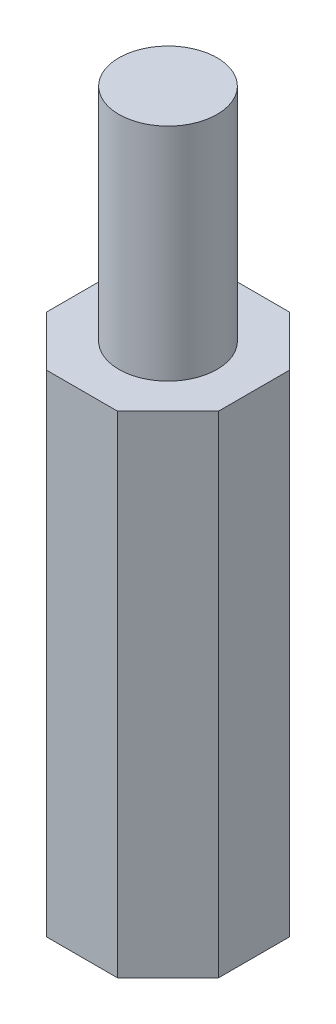
ISO-10303-21;
HEADER;
FILE_DESCRIPTION(('STEP AP214'),'2;1');
FILE_NAME('part.step','',(''),(''),'','','');
FILE_SCHEMA(('AUTOMOTIVE_DESIGN { 1 0 10303 214 1 1 1 1 }'));
ENDSEC;
DATA;
#1=APPLICATION_CONTEXT('core data for automotive mechanical design processes');
#2=APPLICATION_PROTOCOL_DEFINITION('international standard','automotive_design',2000,#1);
#3=PRODUCT_CONTEXT('',#1,'mechanical');
#4=PRODUCT('Part','Part','',(#3));
#5=PRODUCT_RELATED_PRODUCT_CATEGORY('part','',(#4));
#6=PRODUCT_DEFINITION_FORMATION('','',#4);
#7=PRODUCT_DEFINITION_CONTEXT('part definition',#1,'design');
#8=PRODUCT_DEFINITION('design','',#6,#7);
#9=PRODUCT_DEFINITION_SHAPE('','',#8);
#10=(LENGTH_UNIT() NAMED_UNIT(*) SI_UNIT(.MILLI.,.METRE.));
#11=(NAMED_UNIT(*) PLANE_ANGLE_UNIT() SI_UNIT($,.RADIAN.));
#12=(NAMED_UNIT(*) SI_UNIT($,.STERADIAN.) SOLID_ANGLE_UNIT());
#13=UNCERTAINTY_MEASURE_WITH_UNIT(LENGTH_MEASURE(1.E-05),#10,'distance_accuracy_value','');
#14=(GEOMETRIC_REPRESENTATION_CONTEXT(3) GLOBAL_UNCERTAINTY_ASSIGNED_CONTEXT((#13)) GLOBAL_UNIT_ASSIGNED_CONTEXT((#10,
#11,#12)) REPRESENTATION_CONTEXT('',''));
#15=CARTESIAN_POINT('',(0.,0.,0.));
#16=DIRECTION('',(0.,0.,1.));
#17=DIRECTION('',(1.,0.,0.));
#18=AXIS2_PLACEMENT_3D('',#15,#16,#17);
#19=CARTESIAN_POINT('',(-4.94974746830584,10.,0.));
#20=DIRECTION('',(0.,1.,0.));
#21=DIRECTION('',(0.,0.,1.));
#22=AXIS2_PLACEMENT_3D('',#19,#20,#21);
#23=PLANE('',#22);
#24=DIRECTION('',(-0.707106781186548,0.,0.707106781186546));
#25=VECTOR('',#24,1.);
#26=CARTESIAN_POINT('',(-3.5,10.,-1.44974746830583));
#27=LINE('',#26,#25);
#28=CARTESIAN_POINT('',(-1.44974746830583,10.,-3.5));
#29=VERTEX_POINT('',#28);
#30=CARTESIAN_POINT('',(-3.5,10.,-1.44974746830583));
#31=VERTEX_POINT('',#30);
#32=EDGE_CURVE('E144',#29,#31,#27,.T.);
#33=ORIENTED_EDGE('',*,*,#32,.T.);
#34=DIRECTION('',(0.,0.,1.));
#35=VECTOR('',#34,1.);
#36=CARTESIAN_POINT('',(-3.5,10.,1.44974746830583));
#37=LINE('',#36,#35);
#38=CARTESIAN_POINT('',(-3.5,10.,1.44974746830583));
#39=VERTEX_POINT('',#38);
#40=EDGE_CURVE('E92',#31,#39,#37,.T.);
#41=ORIENTED_EDGE('',*,*,#40,.T.);
#42=DIRECTION('',(0.707106781186548,0.,0.707106781186548));
#43=VECTOR('',#42,1.);
#44=CARTESIAN_POINT('',(-1.44974746830583,10.,3.5));
#45=LINE('',#44,#43);
#46=CARTESIAN_POINT('',(-1.44974746830583,10.,3.5));
#47=VERTEX_POINT('',#46);
#48=EDGE_CURVE('E159',#39,#47,#45,.T.);
#49=ORIENTED_EDGE('',*,*,#48,.T.);
#50=DIRECTION('',(1.,0.,0.));
#51=VECTOR('',#50,1.);
#52=CARTESIAN_POINT('',(1.44974746830583,10.,3.5));
#53=LINE('',#52,#51);
#54=CARTESIAN_POINT('',(1.44974746830583,10.,3.5));
#55=VERTEX_POINT('',#54);
#56=EDGE_CURVE('E171',#47,#55,#53,.T.);
#57=ORIENTED_EDGE('',*,*,#56,.T.);
#58=DIRECTION('',(0.707106781186548,0.,-0.707106781186547));
#59=VECTOR('',#58,1.);
#60=CARTESIAN_POINT('',(3.5,10.,1.44974746830583));
#61=LINE('',#60,#59);
#62=CARTESIAN_POINT('',(3.5,10.,1.44974746830583));
#63=VERTEX_POINT('',#62);
#64=EDGE_CURVE('E111',#55,#63,#61,.T.);
#65=ORIENTED_EDGE('',*,*,#64,.T.);
#66=DIRECTION('',(0.,0.,-1.));
#67=VECTOR('',#66,1.);
#68=CARTESIAN_POINT('',(3.5,10.,-1.44974746830583));
#69=LINE('',#68,#67);
#70=CARTESIAN_POINT('',(3.5,10.,-1.44974746830583));
#71=VERTEX_POINT('',#70);
#72=EDGE_CURVE('E105',#63,#71,#69,.T.);
#73=ORIENTED_EDGE('',*,*,#72,.T.);
#74=DIRECTION('',(-0.707106781186548,0.,-0.707106781186547));
#75=VECTOR('',#74,1.);
#76=CARTESIAN_POINT('',(1.44974746830583,10.,-3.5));
#77=LINE('',#76,#75);
#78=CARTESIAN_POINT('',(1.44974746830583,10.,-3.5));
#79=VERTEX_POINT('',#78);
#80=EDGE_CURVE('E109',#71,#79,#77,.T.);
#81=ORIENTED_EDGE('',*,*,#80,.T.);
#82=DIRECTION('',(-1.,0.,0.));
#83=VECTOR('',#82,1.);
#84=CARTESIAN_POINT('',(-1.44974746830583,10.,-3.5));
#85=LINE('',#84,#83);
#86=EDGE_CURVE('E49',#79,#29,#85,.T.);
#87=ORIENTED_EDGE('',*,*,#86,.T.);
#88=EDGE_LOOP('',(#33,#41,#49,#57,#65,#73,#81,#87));
#89=FACE_BOUND('',#88,.T.);
#90=CARTESIAN_POINT('',(0.,10.,0.));
#91=DIRECTION('',(0.,1.,0.));
#92=DIRECTION('',(0.,0.,1.));
#93=AXIS2_PLACEMENT_3D('',#90,#91,#92);
#94=CIRCLE('',#93,2.);
#95=CARTESIAN_POINT('',(0.,10.,2.));
#96=VERTEX_POINT('',#95);
#97=EDGE_CURVE('E177',#96,#96,#94,.T.);
#98=ORIENTED_EDGE('',*,*,#97,.F.);
#99=EDGE_LOOP('',(#98));
#100=FACE_BOUND('',#99,.T.);
#101=ADVANCED_FACE('F32',(#89,#100),#23,.T.);
#102=CARTESIAN_POINT('',(-3.5,10.,-1.44974746830583));
#103=DIRECTION('',(0.707106781186546,0.,0.707106781186548));
#104=DIRECTION('',(0.707106781186549,0.,-0.707106781186547));
#105=AXIS2_PLACEMENT_3D('',#102,#103,#104);
#106=PLANE('',#105);
#107=DIRECTION('',(-0.707106781186548,0.,0.707106781186546));
#108=VECTOR('',#107,1.);
#109=CARTESIAN_POINT('',(-3.5,-10.,-1.44974746830583));
#110=LINE('',#109,#108);
#111=CARTESIAN_POINT('',(-1.44974746830583,-10.,-3.5));
#112=VERTEX_POINT('',#111);
#113=CARTESIAN_POINT('',(-3.5,-10.,-1.44974746830583));
#114=VERTEX_POINT('',#113);
#115=EDGE_CURVE('E129',#112,#114,#110,.T.);
#116=ORIENTED_EDGE('',*,*,#115,.T.);
#117=DIRECTION('',(0.,-1.,0.));
#118=VECTOR('',#117,1.);
#119=CARTESIAN_POINT('',(-3.5,10.,-1.44974746830583));
#120=LINE('',#119,#118);
#121=EDGE_CURVE('E11',#31,#114,#120,.T.);
#122=ORIENTED_EDGE('',*,*,#121,.F.);
#123=ORIENTED_EDGE('',*,*,#32,.F.);
#124=DIRECTION('',(0.,-1.,0.));
#125=VECTOR('',#124,1.);
#126=CARTESIAN_POINT('',(-1.44974746830583,10.,-3.5));
#127=LINE('',#126,#125);
#128=EDGE_CURVE('E125',#29,#112,#127,.T.);
#129=ORIENTED_EDGE('',*,*,#128,.T.);
#130=EDGE_LOOP('',(#116,#122,#123,#129));
#131=FACE_BOUND('',#130,.T.);
#132=ADVANCED_FACE('F34',(#131),#106,.F.);
#133=CARTESIAN_POINT('',(-3.5,10.,1.44974746830583));
#134=DIRECTION('',(1.,0.,0.));
#135=DIRECTION('',(0.,0.,-1.));
#136=AXIS2_PLACEMENT_3D('',#133,#134,#135);
#137=PLANE('',#136);
#138=DIRECTION('',(0.,0.,1.));
#139=VECTOR('',#138,1.);
#140=CARTESIAN_POINT('',(-3.5,-10.,1.44974746830583));
#141=LINE('',#140,#139);
#142=CARTESIAN_POINT('',(-3.5,-10.,1.44974746830583));
#143=VERTEX_POINT('',#142);
#144=EDGE_CURVE('E132',#114,#143,#141,.T.);
#145=ORIENTED_EDGE('',*,*,#144,.T.);
#146=DIRECTION('',(0.,-1.,0.));
#147=VECTOR('',#146,1.);
#148=CARTESIAN_POINT('',(-3.5,10.,1.44974746830583));
#149=LINE('',#148,#147);
#150=EDGE_CURVE('E41',#39,#143,#149,.T.);
#151=ORIENTED_EDGE('',*,*,#150,.F.);
#152=ORIENTED_EDGE('',*,*,#40,.F.);
#153=ORIENTED_EDGE('',*,*,#121,.T.);
#154=EDGE_LOOP('',(#145,#151,#152,#153));
#155=FACE_BOUND('',#154,.T.);
#156=ADVANCED_FACE('F214',(#155),#137,.F.);
#157=CARTESIAN_POINT('',(-1.44974746830583,10.,3.5));
#158=DIRECTION('',(0.707106781186548,0.,-0.707106781186548));
#159=DIRECTION('',(-0.707106781186548,0.,-0.707106781186548));
#160=AXIS2_PLACEMENT_3D('',#157,#158,#159);
#161=PLANE('',#160);
#162=DIRECTION('',(0.707106781186548,0.,0.707106781186548));
#163=VECTOR('',#162,1.);
#164=CARTESIAN_POINT('',(-1.44974746830583,-10.,3.5));
#165=LINE('',#164,#163);
#166=CARTESIAN_POINT('',(-1.44974746830583,-10.,3.5));
#167=VERTEX_POINT('',#166);
#168=EDGE_CURVE('E135',#143,#167,#165,.T.);
#169=ORIENTED_EDGE('',*,*,#168,.T.);
#170=DIRECTION('',(0.,-1.,0.));
#171=VECTOR('',#170,1.);
#172=CARTESIAN_POINT('',(-1.44974746830583,10.,3.5));
#173=LINE('',#172,#171);
#174=EDGE_CURVE('E151',#47,#167,#173,.T.);
#175=ORIENTED_EDGE('',*,*,#174,.F.);
#176=ORIENTED_EDGE('',*,*,#48,.F.);
#177=ORIENTED_EDGE('',*,*,#150,.T.);
#178=EDGE_LOOP('',(#169,#175,#176,#177));
#179=FACE_BOUND('',#178,.T.);
#180=ADVANCED_FACE('F157',(#179),#161,.F.);
#181=CARTESIAN_POINT('',(1.44974746830583,10.,3.5));
#182=DIRECTION('',(0.,0.,-1.));
#183=DIRECTION('',(-1.,0.,0.));
#184=AXIS2_PLACEMENT_3D('',#181,#182,#183);
#185=PLANE('',#184);
#186=DIRECTION('',(1.,0.,0.));
#187=VECTOR('',#186,1.);
#188=CARTESIAN_POINT('',(1.44974746830583,-10.,3.5));
#189=LINE('',#188,#187);
#190=CARTESIAN_POINT('',(1.44974746830583,-10.,3.5));
#191=VERTEX_POINT('',#190);
#192=EDGE_CURVE('E137',#167,#191,#189,.T.);
#193=ORIENTED_EDGE('',*,*,#192,.T.);
#194=DIRECTION('',(0.,-1.,0.));
#195=VECTOR('',#194,1.);
#196=CARTESIAN_POINT('',(1.44974746830583,10.,3.5));
#197=LINE('',#196,#195);
#198=EDGE_CURVE('E148',#55,#191,#197,.T.);
#199=ORIENTED_EDGE('',*,*,#198,.F.);
#200=ORIENTED_EDGE('',*,*,#56,.F.);
#201=ORIENTED_EDGE('',*,*,#174,.T.);
#202=EDGE_LOOP('',(#193,#199,#200,#201));
#203=FACE_BOUND('',#202,.T.);
#204=ADVANCED_FACE('F167',(#203),#185,.F.);
#205=CARTESIAN_POINT('',(3.5,10.,1.44974746830583));
#206=DIRECTION('',(-0.707106781186547,0.,-0.707106781186548));
#207=DIRECTION('',(-0.707106781186548,0.,0.707106781186547));
#208=AXIS2_PLACEMENT_3D('',#205,#206,#207);
#209=PLANE('',#208);
#210=DIRECTION('',(0.707106781186548,0.,-0.707106781186547));
#211=VECTOR('',#210,1.);
#212=CARTESIAN_POINT('',(3.5,-10.,1.44974746830583));
#213=LINE('',#212,#211);
#214=CARTESIAN_POINT('',(3.5,-10.,1.44974746830583));
#215=VERTEX_POINT('',#214);
#216=EDGE_CURVE('E139',#191,#215,#213,.T.);
#217=ORIENTED_EDGE('',*,*,#216,.T.);
#218=DIRECTION('',(0.,-1.,0.));
#219=VECTOR('',#218,1.);
#220=CARTESIAN_POINT('',(3.5,10.,1.44974746830583));
#221=LINE('',#220,#219);
#222=EDGE_CURVE('E120',#63,#215,#221,.T.);
#223=ORIENTED_EDGE('',*,*,#222,.F.);
#224=ORIENTED_EDGE('',*,*,#64,.F.);
#225=ORIENTED_EDGE('',*,*,#198,.T.);
#226=EDGE_LOOP('',(#217,#223,#224,#225));
#227=FACE_BOUND('',#226,.T.);
#228=ADVANCED_FACE('F170',(#227),#209,.F.);
#229=CARTESIAN_POINT('',(3.5,10.,-1.44974746830583));
#230=DIRECTION('',(-1.,0.,0.));
#231=DIRECTION('',(0.,0.,1.));
#232=AXIS2_PLACEMENT_3D('',#229,#230,#231);
#233=PLANE('',#232);
#234=DIRECTION('',(0.,0.,-1.));
#235=VECTOR('',#234,1.);
#236=CARTESIAN_POINT('',(3.5,-10.,-1.44974746830583));
#237=LINE('',#236,#235);
#238=CARTESIAN_POINT('',(3.5,-10.,-1.44974746830583));
#239=VERTEX_POINT('',#238);
#240=EDGE_CURVE('E119',#215,#239,#237,.T.);
#241=ORIENTED_EDGE('',*,*,#240,.T.);
#242=DIRECTION('',(0.,-1.,0.));
#243=VECTOR('',#242,1.);
#244=CARTESIAN_POINT('',(3.5,10.,-1.44974746830583));
#245=LINE('',#244,#243);
#246=EDGE_CURVE('E116',#71,#239,#245,.T.);
#247=ORIENTED_EDGE('',*,*,#246,.F.);
#248=ORIENTED_EDGE('',*,*,#72,.F.);
#249=ORIENTED_EDGE('',*,*,#222,.T.);
#250=EDGE_LOOP('',(#241,#247,#248,#249));
#251=FACE_BOUND('',#250,.T.);
#252=ADVANCED_FACE('F117',(#251),#233,.F.);
#253=CARTESIAN_POINT('',(1.44974746830583,10.,-3.5));
#254=DIRECTION('',(-0.707106781186547,0.,0.707106781186548));
#255=DIRECTION('',(0.707106781186548,0.,0.707106781186547));
#256=AXIS2_PLACEMENT_3D('',#253,#254,#255);
#257=PLANE('',#256);
#258=DIRECTION('',(-0.707106781186548,0.,-0.707106781186547));
#259=VECTOR('',#258,1.);
#260=CARTESIAN_POINT('',(1.44974746830583,-10.,-3.5));
#261=LINE('',#260,#259);
#262=CARTESIAN_POINT('',(1.44974746830583,-10.,-3.5));
#263=VERTEX_POINT('',#262);
#264=EDGE_CURVE('E78',#239,#263,#261,.T.);
#265=ORIENTED_EDGE('',*,*,#264,.T.);
#266=DIRECTION('',(0.,-1.,0.));
#267=VECTOR('',#266,1.);
#268=CARTESIAN_POINT('',(1.44974746830583,10.,-3.5));
#269=LINE('',#268,#267);
#270=EDGE_CURVE('E121',#79,#263,#269,.T.);
#271=ORIENTED_EDGE('',*,*,#270,.F.);
#272=ORIENTED_EDGE('',*,*,#80,.F.);
#273=ORIENTED_EDGE('',*,*,#246,.T.);
#274=EDGE_LOOP('',(#265,#271,#272,#273));
#275=FACE_BOUND('',#274,.T.);
#276=ADVANCED_FACE('F123',(#275),#257,.F.);
#277=CARTESIAN_POINT('',(-1.44974746830583,10.,-3.5));
#278=DIRECTION('',(0.,0.,1.));
#279=DIRECTION('',(1.,0.,0.));
#280=AXIS2_PLACEMENT_3D('',#277,#278,#279);
#281=PLANE('',#280);
#282=DIRECTION('',(-1.,0.,0.));
#283=VECTOR('',#282,1.);
#284=CARTESIAN_POINT('',(-1.44974746830583,-10.,-3.5));
#285=LINE('',#284,#283);
#286=EDGE_CURVE('E84',#263,#112,#285,.T.);
#287=ORIENTED_EDGE('',*,*,#286,.T.);
#288=ORIENTED_EDGE('',*,*,#128,.F.);
#289=ORIENTED_EDGE('',*,*,#86,.F.);
#290=ORIENTED_EDGE('',*,*,#270,.T.);
#291=EDGE_LOOP('',(#287,#288,#289,#290));
#292=FACE_BOUND('',#291,.T.);
#293=ADVANCED_FACE('F200',(#292),#281,.F.);
#294=CARTESIAN_POINT('',(-4.94974746830584,-10.,0.));
#295=DIRECTION('',(0.,1.,0.));
#296=DIRECTION('',(0.,0.,1.));
#297=AXIS2_PLACEMENT_3D('',#294,#295,#296);
#298=PLANE('',#297);
#299=CARTESIAN_POINT('',(0.,-10.,0.));
#300=DIRECTION('',(0.,-1.,0.));
#301=DIRECTION('',(0.,0.,-1.));
#302=AXIS2_PLACEMENT_3D('',#299,#300,#301);
#303=CIRCLE('',#302,2.);
#304=CARTESIAN_POINT('',(0.,-10.,-2.));
#305=VERTEX_POINT('',#304);
#306=EDGE_CURVE('E183',#305,#305,#303,.T.);
#307=ORIENTED_EDGE('',*,*,#306,.F.);
#308=EDGE_LOOP('',(#307));
#309=FACE_BOUND('',#308,.T.);
#310=ORIENTED_EDGE('',*,*,#115,.F.);
#311=ORIENTED_EDGE('',*,*,#286,.F.);
#312=ORIENTED_EDGE('',*,*,#264,.F.);
#313=ORIENTED_EDGE('',*,*,#240,.F.);
#314=ORIENTED_EDGE('',*,*,#216,.F.);
#315=ORIENTED_EDGE('',*,*,#192,.F.);
#316=ORIENTED_EDGE('',*,*,#168,.F.);
#317=ORIENTED_EDGE('',*,*,#144,.F.);
#318=EDGE_LOOP('',(#310,#311,#312,#313,#314,#315,#316,#317));
#319=FACE_BOUND('',#318,.T.);
#320=ADVANCED_FACE('F163',(#309,#319),#298,.F.);
#321=CARTESIAN_POINT('',(0.,19.,0.));
#322=DIRECTION('',(0.,-1.,0.));
#323=DIRECTION('',(0.,0.,-1.));
#324=AXIS2_PLACEMENT_3D('',#321,#322,#323);
#325=CYLINDRICAL_SURFACE('',#324,2.);
#326=CARTESIAN_POINT('',(0.,19.,0.));
#327=DIRECTION('',(0.,1.,0.));
#328=DIRECTION('',(0.,0.,1.));
#329=AXIS2_PLACEMENT_3D('',#326,#327,#328);
#330=CIRCLE('',#329,2.);
#331=CARTESIAN_POINT('',(0.,19.,2.));
#332=VERTEX_POINT('',#331);
#333=EDGE_CURVE('E133',#332,#332,#330,.T.);
#334=ORIENTED_EDGE('',*,*,#333,.F.);
#335=EDGE_LOOP('',(#334));
#336=FACE_BOUND('',#335,.T.);
#337=ORIENTED_EDGE('',*,*,#97,.T.);
#338=EDGE_LOOP('',(#337));
#339=FACE_BOUND('',#338,.T.);
#340=ADVANCED_FACE('F199',(#336,#339),#325,.T.);
#341=CARTESIAN_POINT('',(0.,19.,0.));
#342=DIRECTION('',(0.,1.,0.));
#343=DIRECTION('',(0.,0.,1.));
#344=AXIS2_PLACEMENT_3D('',#341,#342,#343);
#345=PLANE('',#344);
#346=ORIENTED_EDGE('',*,*,#333,.T.);
#347=EDGE_LOOP('',(#346));
#348=FACE_BOUND('',#347,.T.);
#349=ADVANCED_FACE('F194',(#348),#345,.T.);
#350=CARTESIAN_POINT('',(0.,-1.,0.));
#351=DIRECTION('',(0.,-1.,0.));
#352=DIRECTION('',(0.,0.,-1.));
#353=AXIS2_PLACEMENT_3D('',#350,#351,#352);
#354=CYLINDRICAL_SURFACE('',#353,2.);
#355=CARTESIAN_POINT('',(0.,-1.,0.));
#356=DIRECTION('',(0.,-1.,0.));
#357=DIRECTION('',(0.,0.,-1.));
#358=AXIS2_PLACEMENT_3D('',#355,#356,#357);
#359=CIRCLE('',#358,2.);
#360=CARTESIAN_POINT('',(0.,-1.,-2.));
#361=VERTEX_POINT('',#360);
#362=EDGE_CURVE('E180',#361,#361,#359,.T.);
#363=ORIENTED_EDGE('',*,*,#362,.F.);
#364=EDGE_LOOP('',(#363));
#365=FACE_BOUND('',#364,.T.);
#366=ORIENTED_EDGE('',*,*,#306,.T.);
#367=EDGE_LOOP('',(#366));
#368=FACE_BOUND('',#367,.T.);
#369=ADVANCED_FACE('F191',(#365,#368),#354,.F.);
#370=CARTESIAN_POINT('',(0.,-1.,0.));
#371=DIRECTION('',(0.,-1.,0.));
#372=DIRECTION('',(0.,0.,-1.));
#373=AXIS2_PLACEMENT_3D('',#370,#371,#372);
#374=PLANE('',#373);
#375=ORIENTED_EDGE('',*,*,#362,.T.);
#376=EDGE_LOOP('',(#375));
#377=FACE_BOUND('',#376,.T.);
#378=ADVANCED_FACE('F189',(#377),#374,.T.);
#379=CLOSED_SHELL('',(#101,#132,#156,#180,#204,#228,#252,#276,#293,#320,#340,#349,#369,#378));
#380=MANIFOLD_SOLID_BREP('B2',#379);
#381=ADVANCED_BREP_SHAPE_REPRESENTATION('',(#18,#380),#14);
#382=SHAPE_DEFINITION_REPRESENTATION(#9,#381);
ENDSEC;
END-ISO-10303-21;
